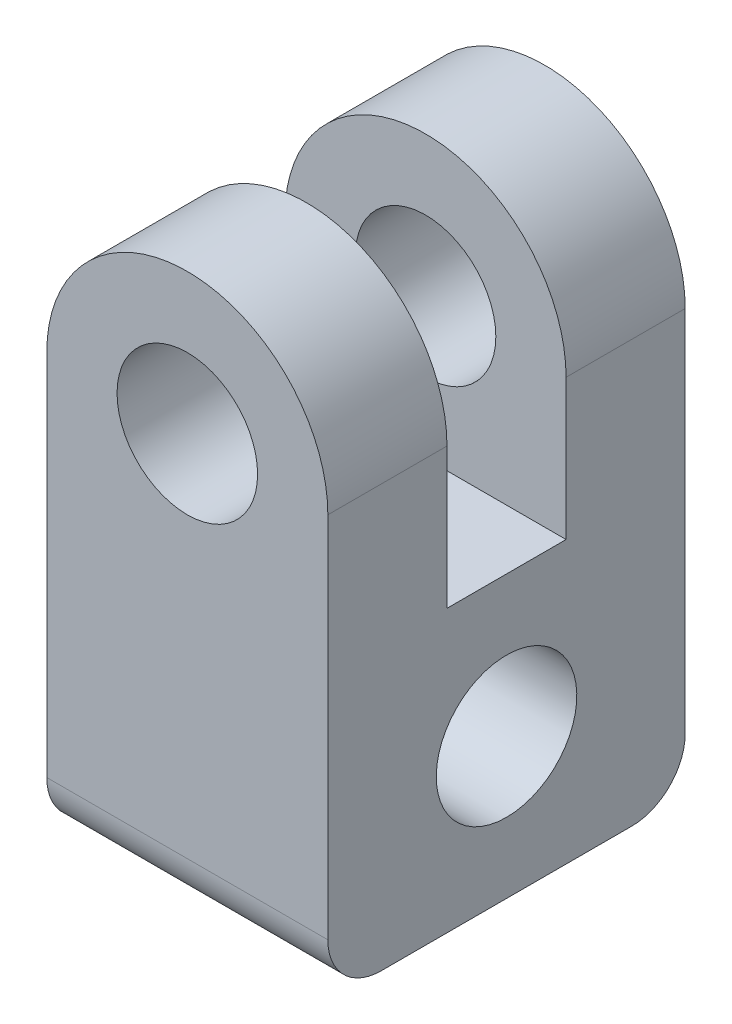
ISO-10303-21;
HEADER;
FILE_DESCRIPTION(('STEP AP214'),'2;1');
FILE_NAME('part.step','',(''),(''),'','','');
FILE_SCHEMA(('AUTOMOTIVE_DESIGN { 1 0 10303 214 1 1 1 1 }'));
ENDSEC;
DATA;
#1=APPLICATION_CONTEXT('core data for automotive mechanical design processes');
#2=APPLICATION_PROTOCOL_DEFINITION('international standard','automotive_design',2000,#1);
#3=PRODUCT_CONTEXT('',#1,'mechanical');
#4=PRODUCT('Part','Part','',(#3));
#5=PRODUCT_RELATED_PRODUCT_CATEGORY('part','',(#4));
#6=PRODUCT_DEFINITION_FORMATION('','',#4);
#7=PRODUCT_DEFINITION_CONTEXT('part definition',#1,'design');
#8=PRODUCT_DEFINITION('design','',#6,#7);
#9=PRODUCT_DEFINITION_SHAPE('','',#8);
#10=(LENGTH_UNIT() NAMED_UNIT(*) SI_UNIT(.MILLI.,.METRE.));
#11=(NAMED_UNIT(*) PLANE_ANGLE_UNIT() SI_UNIT($,.RADIAN.));
#12=(NAMED_UNIT(*) SI_UNIT($,.STERADIAN.) SOLID_ANGLE_UNIT());
#13=UNCERTAINTY_MEASURE_WITH_UNIT(LENGTH_MEASURE(1.E-05),#10,'distance_accuracy_value','');
#14=(GEOMETRIC_REPRESENTATION_CONTEXT(3) GLOBAL_UNCERTAINTY_ASSIGNED_CONTEXT((#13)) GLOBAL_UNIT_ASSIGNED_CONTEXT((#10,
#11,#12)) REPRESENTATION_CONTEXT('',''));
#15=CARTESIAN_POINT('',(0.,0.,0.));
#16=DIRECTION('',(0.,0.,1.));
#17=DIRECTION('',(1.,0.,0.));
#18=AXIS2_PLACEMENT_3D('',#15,#16,#17);
#19=CARTESIAN_POINT('',(0.,0.,133.5));
#20=DIRECTION('',(0.,0.,-1.));
#21=DIRECTION('',(-1.,0.,0.));
#22=AXIS2_PLACEMENT_3D('',#19,#20,#21);
#23=CYLINDRICAL_SURFACE('',#22,52.5);
#24=CARTESIAN_POINT('',(0.,0.,44.5));
#25=DIRECTION('',(0.,0.,1.));
#26=DIRECTION('',(1.,0.,0.));
#27=AXIS2_PLACEMENT_3D('',#24,#25,#26);
#28=CIRCLE('',#27,52.5);
#29=CARTESIAN_POINT('',(52.5,0.,44.5));
#30=VERTEX_POINT('',#29);
#31=CARTESIAN_POINT('',(-52.5,0.,44.5));
#32=VERTEX_POINT('',#31);
#33=EDGE_CURVE('E131',#30,#32,#28,.T.);
#34=ORIENTED_EDGE('',*,*,#33,.F.);
#35=DIRECTION('',(0.,0.,-1.));
#36=VECTOR('',#35,1.);
#37=CARTESIAN_POINT('',(52.5,0.,133.5));
#38=LINE('',#37,#36);
#39=CARTESIAN_POINT('',(52.5,0.,0.));
#40=VERTEX_POINT('',#39);
#41=EDGE_CURVE('E203',#30,#40,#38,.T.);
#42=ORIENTED_EDGE('',*,*,#41,.T.);
#43=CARTESIAN_POINT('',(0.,0.,0.));
#44=DIRECTION('',(0.,0.,1.));
#45=DIRECTION('',(-1.,0.,0.));
#46=AXIS2_PLACEMENT_3D('',#43,#44,#45);
#47=CIRCLE('',#46,52.5);
#48=CARTESIAN_POINT('',(-52.5,0.,0.));
#49=VERTEX_POINT('',#48);
#50=EDGE_CURVE('E187',#40,#49,#47,.T.);
#51=ORIENTED_EDGE('',*,*,#50,.T.);
#52=DIRECTION('',(0.,0.,-1.));
#53=VECTOR('',#52,1.);
#54=CARTESIAN_POINT('',(-52.5,0.,133.5));
#55=LINE('',#54,#53);
#56=EDGE_CURVE('E223',#32,#49,#55,.T.);
#57=ORIENTED_EDGE('',*,*,#56,.F.);
#58=EDGE_LOOP('',(#34,#42,#51,#57));
#59=FACE_BOUND('',#58,.T.);
#60=ADVANCED_FACE('F47',(#59),#23,.T.);
#61=CARTESIAN_POINT('',(0.,0.,89.));
#62=DIRECTION('',(0.,0.,-1.));
#63=DIRECTION('',(-1.,0.,0.));
#64=AXIS2_PLACEMENT_3D('',#61,#62,#63);
#65=CIRCLE('',#64,52.5);
#66=CARTESIAN_POINT('',(-52.5,0.,89.));
#67=VERTEX_POINT('',#66);
#68=CARTESIAN_POINT('',(52.5,0.,89.));
#69=VERTEX_POINT('',#68);
#70=EDGE_CURVE('E168',#67,#69,#65,.T.);
#71=ORIENTED_EDGE('',*,*,#70,.F.);
#72=CARTESIAN_POINT('',(-52.5,0.,133.5));
#73=VERTEX_POINT('',#72);
#74=EDGE_CURVE('E224',#73,#67,#55,.T.);
#75=ORIENTED_EDGE('',*,*,#74,.F.);
#76=CARTESIAN_POINT('',(0.,0.,133.5));
#77=DIRECTION('',(0.,0.,1.));
#78=DIRECTION('',(-1.,0.,0.));
#79=AXIS2_PLACEMENT_3D('',#76,#77,#78);
#80=CIRCLE('',#79,52.5);
#81=CARTESIAN_POINT('',(52.5,0.,133.5));
#82=VERTEX_POINT('',#81);
#83=EDGE_CURVE('E191',#82,#73,#80,.T.);
#84=ORIENTED_EDGE('',*,*,#83,.F.);
#85=EDGE_CURVE('E212',#82,#69,#38,.T.);
#86=ORIENTED_EDGE('',*,*,#85,.T.);
#87=EDGE_LOOP('',(#71,#75,#84,#86));
#88=FACE_BOUND('',#87,.T.);
#89=ADVANCED_FACE('F354',(#88),#23,.T.);
#90=CARTESIAN_POINT('',(-52.5,0.,133.5));
#91=DIRECTION('',(1.,0.,0.));
#92=DIRECTION('',(0.,1.,0.));
#93=AXIS2_PLACEMENT_3D('',#90,#91,#92);
#94=PLANE('',#93);
#95=CARTESIAN_POINT('',(-52.5,-105.,66.7500000000001));
#96=DIRECTION('',(-1.,0.,0.));
#97=DIRECTION('',(0.,-1.,0.));
#98=AXIS2_PLACEMENT_3D('',#95,#96,#97);
#99=CIRCLE('',#98,26.25);
#100=CARTESIAN_POINT('',(-52.5,-131.25,66.7500000000001));
#101=VERTEX_POINT('',#100);
#102=EDGE_CURVE('E174',#101,#101,#99,.T.);
#103=ORIENTED_EDGE('',*,*,#102,.F.);
#104=EDGE_LOOP('',(#103));
#105=FACE_BOUND('',#104,.T.);
#106=DIRECTION('',(0.,0.,-1.));
#107=VECTOR('',#106,1.);
#108=CARTESIAN_POINT('',(-52.5,-157.5,133.5));
#109=LINE('',#108,#107);
#110=CARTESIAN_POINT('',(-52.5,-157.5,113.5));
#111=VERTEX_POINT('',#110);
#112=CARTESIAN_POINT('',(-52.5,-157.5,20.));
#113=VERTEX_POINT('',#112);
#114=EDGE_CURVE('E220',#111,#113,#109,.T.);
#115=ORIENTED_EDGE('',*,*,#114,.F.);
#116=CARTESIAN_POINT('',(-52.5,-137.5,113.5));
#117=DIRECTION('',(1.,0.,0.));
#118=DIRECTION('',(0.,1.,0.));
#119=AXIS2_PLACEMENT_3D('',#116,#117,#118);
#120=CIRCLE('',#119,20.);
#121=CARTESIAN_POINT('',(-52.5,-137.5,133.5));
#122=VERTEX_POINT('',#121);
#123=EDGE_CURVE('E56',#111,#122,#120,.F.);
#124=ORIENTED_EDGE('',*,*,#123,.T.);
#125=DIRECTION('',(0.,-1.,0.));
#126=VECTOR('',#125,1.);
#127=CARTESIAN_POINT('',(-52.5,0.,133.5));
#128=LINE('',#127,#126);
#129=EDGE_CURVE('E195',#73,#122,#128,.T.);
#130=ORIENTED_EDGE('',*,*,#129,.F.);
#131=ORIENTED_EDGE('',*,*,#74,.T.);
#132=DIRECTION('',(0.,1.,0.));
#133=VECTOR('',#132,1.);
#134=CARTESIAN_POINT('',(-52.5,-52.5,89.));
#135=LINE('',#134,#133);
#136=CARTESIAN_POINT('',(-52.5,-52.5,89.));
#137=VERTEX_POINT('',#136);
#138=EDGE_CURVE('E150',#137,#67,#135,.T.);
#139=ORIENTED_EDGE('',*,*,#138,.F.);
#140=DIRECTION('',(0.,0.,-1.));
#141=VECTOR('',#140,1.);
#142=CARTESIAN_POINT('',(-52.5,-52.5,66.7500000000001));
#143=LINE('',#142,#141);
#144=CARTESIAN_POINT('',(-52.5,-52.5,44.5));
#145=VERTEX_POINT('',#144);
#146=EDGE_CURVE('E141',#137,#145,#143,.T.);
#147=ORIENTED_EDGE('',*,*,#146,.T.);
#148=DIRECTION('',(0.,1.,0.));
#149=VECTOR('',#148,1.);
#150=CARTESIAN_POINT('',(-52.5,-52.5,44.5));
#151=LINE('',#150,#149);
#152=EDGE_CURVE('E125',#145,#32,#151,.T.);
#153=ORIENTED_EDGE('',*,*,#152,.T.);
#154=ORIENTED_EDGE('',*,*,#56,.T.);
#155=DIRECTION('',(0.,-1.,0.));
#156=VECTOR('',#155,1.);
#157=CARTESIAN_POINT('',(-52.5,0.,0.));
#158=LINE('',#157,#156);
#159=CARTESIAN_POINT('',(-52.5,-137.5,0.));
#160=VERTEX_POINT('',#159);
#161=EDGE_CURVE('E207',#49,#160,#158,.T.);
#162=ORIENTED_EDGE('',*,*,#161,.T.);
#163=CARTESIAN_POINT('',(-52.5,-137.5,20.));
#164=DIRECTION('',(1.,0.,0.));
#165=DIRECTION('',(0.,1.,0.));
#166=AXIS2_PLACEMENT_3D('',#163,#164,#165);
#167=CIRCLE('',#166,20.);
#168=EDGE_CURVE('E68',#160,#113,#167,.F.);
#169=ORIENTED_EDGE('',*,*,#168,.T.);
#170=EDGE_LOOP('',(#115,#124,#130,#131,#139,#147,#153,#154,#162,#169));
#171=FACE_BOUND('',#170,.T.);
#172=ADVANCED_FACE('F148',(#105,#171),#94,.F.);
#173=CARTESIAN_POINT('',(52.5,-157.5,133.5));
#174=DIRECTION('',(-1.,0.,0.));
#175=DIRECTION('',(0.,0.,1.));
#176=AXIS2_PLACEMENT_3D('',#173,#174,#175);
#177=PLANE('',#176);
#178=CARTESIAN_POINT('',(52.5,-105.,66.7500000000001));
#179=DIRECTION('',(-1.,0.,0.));
#180=DIRECTION('',(0.,-1.,0.));
#181=AXIS2_PLACEMENT_3D('',#178,#179,#180);
#182=CIRCLE('',#181,26.25);
#183=CARTESIAN_POINT('',(52.5,-131.25,66.7500000000001));
#184=VERTEX_POINT('',#183);
#185=EDGE_CURVE('E175',#184,#184,#182,.T.);
#186=ORIENTED_EDGE('',*,*,#185,.T.);
#187=EDGE_LOOP('',(#186));
#188=FACE_BOUND('',#187,.T.);
#189=DIRECTION('',(0.,1.,0.));
#190=VECTOR('',#189,1.);
#191=CARTESIAN_POINT('',(52.5,-157.5,133.5));
#192=LINE('',#191,#190);
#193=CARTESIAN_POINT('',(52.5,-137.5,133.5));
#194=VERTEX_POINT('',#193);
#195=EDGE_CURVE('E200',#194,#82,#192,.T.);
#196=ORIENTED_EDGE('',*,*,#195,.F.);
#197=CARTESIAN_POINT('',(52.5,-137.5,113.5));
#198=DIRECTION('',(-1.,0.,0.));
#199=DIRECTION('',(0.,0.,1.));
#200=AXIS2_PLACEMENT_3D('',#197,#198,#199);
#201=CIRCLE('',#200,20.);
#202=CARTESIAN_POINT('',(52.5,-157.5,113.5));
#203=VERTEX_POINT('',#202);
#204=EDGE_CURVE('E240',#194,#203,#201,.F.);
#205=ORIENTED_EDGE('',*,*,#204,.T.);
#206=DIRECTION('',(0.,0.,-1.));
#207=VECTOR('',#206,1.);
#208=CARTESIAN_POINT('',(52.5,-157.5,133.5));
#209=LINE('',#208,#207);
#210=CARTESIAN_POINT('',(52.5,-157.5,20.));
#211=VERTEX_POINT('',#210);
#212=EDGE_CURVE('E216',#203,#211,#209,.T.);
#213=ORIENTED_EDGE('',*,*,#212,.T.);
#214=CARTESIAN_POINT('',(52.5,-137.5,20.));
#215=DIRECTION('',(-1.,0.,0.));
#216=DIRECTION('',(0.,0.,1.));
#217=AXIS2_PLACEMENT_3D('',#214,#215,#216);
#218=CIRCLE('',#217,20.);
#219=CARTESIAN_POINT('',(52.5,-137.5,0.));
#220=VERTEX_POINT('',#219);
#221=EDGE_CURVE('E237',#211,#220,#218,.F.);
#222=ORIENTED_EDGE('',*,*,#221,.T.);
#223=DIRECTION('',(0.,1.,0.));
#224=VECTOR('',#223,1.);
#225=CARTESIAN_POINT('',(52.5,-157.5,0.));
#226=LINE('',#225,#224);
#227=EDGE_CURVE('E196',#220,#40,#226,.T.);
#228=ORIENTED_EDGE('',*,*,#227,.T.);
#229=ORIENTED_EDGE('',*,*,#41,.F.);
#230=DIRECTION('',(0.,1.,0.));
#231=VECTOR('',#230,1.);
#232=CARTESIAN_POINT('',(52.5,-52.5,44.5));
#233=LINE('',#232,#231);
#234=CARTESIAN_POINT('',(52.5,-52.5,44.5));
#235=VERTEX_POINT('',#234);
#236=EDGE_CURVE('E136',#235,#30,#233,.T.);
#237=ORIENTED_EDGE('',*,*,#236,.F.);
#238=DIRECTION('',(0.,0.,1.));
#239=VECTOR('',#238,1.);
#240=CARTESIAN_POINT('',(52.5,-52.5,89.));
#241=LINE('',#240,#239);
#242=CARTESIAN_POINT('',(52.5,-52.5,89.));
#243=VERTEX_POINT('',#242);
#244=EDGE_CURVE('E144',#235,#243,#241,.T.);
#245=ORIENTED_EDGE('',*,*,#244,.T.);
#246=DIRECTION('',(0.,1.,0.));
#247=VECTOR('',#246,1.);
#248=CARTESIAN_POINT('',(52.5,-52.5,89.));
#249=LINE('',#248,#247);
#250=EDGE_CURVE('E162',#243,#69,#249,.T.);
#251=ORIENTED_EDGE('',*,*,#250,.T.);
#252=ORIENTED_EDGE('',*,*,#85,.F.);
#253=EDGE_LOOP('',(#196,#205,#213,#222,#228,#229,#237,#245,#251,#252));
#254=FACE_BOUND('',#253,.T.);
#255=ADVANCED_FACE('F266',(#188,#254),#177,.F.);
#256=CARTESIAN_POINT('',(0.,0.,133.5));
#257=DIRECTION('',(0.,0.,-1.));
#258=DIRECTION('',(-1.,0.,0.));
#259=AXIS2_PLACEMENT_3D('',#256,#257,#258);
#260=CYLINDRICAL_SURFACE('',#259,26.25);
#261=CARTESIAN_POINT('',(0.,0.,0.));
#262=DIRECTION('',(0.,0.,1.));
#263=DIRECTION('',(1.,0.,0.));
#264=AXIS2_PLACEMENT_3D('',#261,#262,#263);
#265=CIRCLE('',#264,26.25);
#266=CARTESIAN_POINT('',(26.25,0.,0.));
#267=VERTEX_POINT('',#266);
#268=EDGE_CURVE('E179',#267,#267,#265,.T.);
#269=ORIENTED_EDGE('',*,*,#268,.F.);
#270=EDGE_LOOP('',(#269));
#271=FACE_BOUND('',#270,.T.);
#272=CARTESIAN_POINT('',(0.,0.,44.5));
#273=DIRECTION('',(0.,0.,1.));
#274=DIRECTION('',(1.,0.,0.));
#275=AXIS2_PLACEMENT_3D('',#272,#273,#274);
#276=CIRCLE('',#275,26.25);
#277=CARTESIAN_POINT('',(26.25,0.,44.5));
#278=VERTEX_POINT('',#277);
#279=EDGE_CURVE('E171',#278,#278,#276,.T.);
#280=ORIENTED_EDGE('',*,*,#279,.T.);
#281=EDGE_LOOP('',(#280));
#282=FACE_BOUND('',#281,.T.);
#283=ADVANCED_FACE('F428',(#271,#282),#260,.F.);
#284=CARTESIAN_POINT('',(0.,0.,133.5));
#285=DIRECTION('',(0.,0.,1.));
#286=DIRECTION('',(1.,0.,0.));
#287=AXIS2_PLACEMENT_3D('',#284,#285,#286);
#288=CIRCLE('',#287,26.25);
#289=CARTESIAN_POINT('',(26.25,0.,133.5));
#290=VERTEX_POINT('',#289);
#291=EDGE_CURVE('E183',#290,#290,#288,.T.);
#292=ORIENTED_EDGE('',*,*,#291,.T.);
#293=EDGE_LOOP('',(#292));
#294=FACE_BOUND('',#293,.T.);
#295=CARTESIAN_POINT('',(0.,0.,89.));
#296=DIRECTION('',(0.,0.,-1.));
#297=DIRECTION('',(-1.,0.,0.));
#298=AXIS2_PLACEMENT_3D('',#295,#296,#297);
#299=CIRCLE('',#298,26.25);
#300=CARTESIAN_POINT('',(-26.25,0.,89.));
#301=VERTEX_POINT('',#300);
#302=EDGE_CURVE('E135',#301,#301,#299,.T.);
#303=ORIENTED_EDGE('',*,*,#302,.T.);
#304=EDGE_LOOP('',(#303));
#305=FACE_BOUND('',#304,.T.);
#306=ADVANCED_FACE('F437',(#294,#305),#260,.F.);
#307=CARTESIAN_POINT('',(0.,0.,133.5));
#308=DIRECTION('',(0.,0.,-1.));
#309=DIRECTION('',(-1.,0.,0.));
#310=AXIS2_PLACEMENT_3D('',#307,#308,#309);
#311=PLANE('',#310);
#312=ORIENTED_EDGE('',*,*,#129,.T.);
#313=DIRECTION('',(1.,0.,0.));
#314=VECTOR('',#313,1.);
#315=CARTESIAN_POINT('',(0.,-137.5,133.5));
#316=LINE('',#315,#314);
#317=EDGE_CURVE('E227',#122,#194,#316,.T.);
#318=ORIENTED_EDGE('',*,*,#317,.T.);
#319=ORIENTED_EDGE('',*,*,#195,.T.);
#320=ORIENTED_EDGE('',*,*,#83,.T.);
#321=EDGE_LOOP('',(#312,#318,#319,#320));
#322=FACE_BOUND('',#321,.T.);
#323=ORIENTED_EDGE('',*,*,#291,.F.);
#324=EDGE_LOOP('',(#323));
#325=FACE_BOUND('',#324,.T.);
#326=ADVANCED_FACE('F258',(#322,#325),#311,.F.);
#327=CARTESIAN_POINT('',(0.,0.,0.));
#328=DIRECTION('',(0.,0.,-1.));
#329=DIRECTION('',(-1.,0.,0.));
#330=AXIS2_PLACEMENT_3D('',#327,#328,#329);
#331=PLANE('',#330);
#332=ORIENTED_EDGE('',*,*,#227,.F.);
#333=DIRECTION('',(1.,0.,0.));
#334=VECTOR('',#333,1.);
#335=CARTESIAN_POINT('',(-52.5,-137.5,0.));
#336=LINE('',#335,#334);
#337=EDGE_CURVE('E11',#220,#160,#336,.F.);
#338=ORIENTED_EDGE('',*,*,#337,.T.);
#339=ORIENTED_EDGE('',*,*,#161,.F.);
#340=ORIENTED_EDGE('',*,*,#50,.F.);
#341=EDGE_LOOP('',(#332,#338,#339,#340));
#342=FACE_BOUND('',#341,.T.);
#343=ORIENTED_EDGE('',*,*,#268,.T.);
#344=EDGE_LOOP('',(#343));
#345=FACE_BOUND('',#344,.T.);
#346=ADVANCED_FACE('F275',(#342,#345),#331,.T.);
#347=CARTESIAN_POINT('',(-52.5,-157.5,133.5));
#348=DIRECTION('',(0.,1.,0.));
#349=DIRECTION('',(0.,0.,1.));
#350=AXIS2_PLACEMENT_3D('',#347,#348,#349);
#351=PLANE('',#350);
#352=ORIENTED_EDGE('',*,*,#212,.F.);
#353=DIRECTION('',(1.,0.,0.));
#354=VECTOR('',#353,1.);
#355=CARTESIAN_POINT('',(-52.5,-157.5,113.5));
#356=LINE('',#355,#354);
#357=EDGE_CURVE('E247',#203,#111,#356,.F.);
#358=ORIENTED_EDGE('',*,*,#357,.T.);
#359=ORIENTED_EDGE('',*,*,#114,.T.);
#360=DIRECTION('',(1.,0.,0.));
#361=VECTOR('',#360,1.);
#362=CARTESIAN_POINT('',(52.5,-157.5,20.));
#363=LINE('',#362,#361);
#364=EDGE_CURVE('E243',#113,#211,#363,.T.);
#365=ORIENTED_EDGE('',*,*,#364,.T.);
#366=EDGE_LOOP('',(#352,#358,#359,#365));
#367=FACE_BOUND('',#366,.T.);
#368=ADVANCED_FACE('F269',(#367),#351,.F.);
#369=CARTESIAN_POINT('',(52.5,-105.,66.7500000000001));
#370=DIRECTION('',(-1.,0.,0.));
#371=DIRECTION('',(0.,-1.,0.));
#372=AXIS2_PLACEMENT_3D('',#369,#370,#371);
#373=CYLINDRICAL_SURFACE('',#372,26.25);
#374=ORIENTED_EDGE('',*,*,#185,.F.);
#375=EDGE_LOOP('',(#374));
#376=FACE_BOUND('',#375,.T.);
#377=ORIENTED_EDGE('',*,*,#102,.T.);
#378=EDGE_LOOP('',(#377));
#379=FACE_BOUND('',#378,.T.);
#380=ADVANCED_FACE('F364',(#376,#379),#373,.F.);
#381=CARTESIAN_POINT('',(52.5,-52.5,44.5));
#382=DIRECTION('',(0.,0.,1.));
#383=DIRECTION('',(1.,0.,0.));
#384=AXIS2_PLACEMENT_3D('',#381,#382,#383);
#385=PLANE('',#384);
#386=ORIENTED_EDGE('',*,*,#279,.F.);
#387=EDGE_LOOP('',(#386));
#388=FACE_BOUND('',#387,.T.);
#389=ORIENTED_EDGE('',*,*,#33,.T.);
#390=ORIENTED_EDGE('',*,*,#152,.F.);
#391=DIRECTION('',(1.,0.,0.));
#392=VECTOR('',#391,1.);
#393=CARTESIAN_POINT('',(52.5,-52.5,44.5));
#394=LINE('',#393,#392);
#395=EDGE_CURVE('E128',#145,#235,#394,.T.);
#396=ORIENTED_EDGE('',*,*,#395,.T.);
#397=ORIENTED_EDGE('',*,*,#236,.T.);
#398=EDGE_LOOP('',(#389,#390,#396,#397));
#399=FACE_BOUND('',#398,.T.);
#400=ADVANCED_FACE('F127',(#388,#399),#385,.T.);
#401=CARTESIAN_POINT('',(-52.5,-52.5,89.));
#402=DIRECTION('',(0.,0.,-1.));
#403=DIRECTION('',(-1.,0.,0.));
#404=AXIS2_PLACEMENT_3D('',#401,#402,#403);
#405=PLANE('',#404);
#406=ORIENTED_EDGE('',*,*,#302,.F.);
#407=EDGE_LOOP('',(#406));
#408=FACE_BOUND('',#407,.T.);
#409=ORIENTED_EDGE('',*,*,#70,.T.);
#410=ORIENTED_EDGE('',*,*,#250,.F.);
#411=DIRECTION('',(-1.,0.,0.));
#412=VECTOR('',#411,1.);
#413=CARTESIAN_POINT('',(-52.5,-52.5,89.));
#414=LINE('',#413,#412);
#415=EDGE_CURVE('E157',#243,#137,#414,.T.);
#416=ORIENTED_EDGE('',*,*,#415,.T.);
#417=ORIENTED_EDGE('',*,*,#138,.T.);
#418=EDGE_LOOP('',(#409,#410,#416,#417));
#419=FACE_BOUND('',#418,.T.);
#420=ADVANCED_FACE('F355',(#408,#419),#405,.T.);
#421=CARTESIAN_POINT('',(0.,-52.5,0.));
#422=DIRECTION('',(0.,1.,0.));
#423=DIRECTION('',(0.,0.,1.));
#424=AXIS2_PLACEMENT_3D('',#421,#422,#423);
#425=PLANE('',#424);
#426=ORIENTED_EDGE('',*,*,#146,.F.);
#427=ORIENTED_EDGE('',*,*,#415,.F.);
#428=ORIENTED_EDGE('',*,*,#244,.F.);
#429=ORIENTED_EDGE('',*,*,#395,.F.);
#430=EDGE_LOOP('',(#426,#427,#428,#429));
#431=FACE_BOUND('',#430,.T.);
#432=ADVANCED_FACE('F140',(#431),#425,.T.);
#433=CARTESIAN_POINT('',(0.,-137.5,113.5));
#434=DIRECTION('',(1.,0.,0.));
#435=DIRECTION('',(0.,0.,-1.));
#436=AXIS2_PLACEMENT_3D('',#433,#434,#435);
#437=CYLINDRICAL_SURFACE('',#436,20.);
#438=ORIENTED_EDGE('',*,*,#123,.F.);
#439=ORIENTED_EDGE('',*,*,#357,.F.);
#440=ORIENTED_EDGE('',*,*,#204,.F.);
#441=ORIENTED_EDGE('',*,*,#317,.F.);
#442=EDGE_LOOP('',(#438,#439,#440,#441));
#443=FACE_BOUND('',#442,.T.);
#444=ADVANCED_FACE('F263',(#443),#437,.T.);
#445=CARTESIAN_POINT('',(-52.5,-137.5,20.));
#446=DIRECTION('',(-1.,0.,0.));
#447=DIRECTION('',(0.,0.,1.));
#448=AXIS2_PLACEMENT_3D('',#445,#446,#447);
#449=CYLINDRICAL_SURFACE('',#448,20.);
#450=ORIENTED_EDGE('',*,*,#168,.F.);
#451=ORIENTED_EDGE('',*,*,#337,.F.);
#452=ORIENTED_EDGE('',*,*,#221,.F.);
#453=ORIENTED_EDGE('',*,*,#364,.F.);
#454=EDGE_LOOP('',(#450,#451,#452,#453));
#455=FACE_BOUND('',#454,.T.);
#456=ADVANCED_FACE('F49',(#455),#449,.T.);
#457=CLOSED_SHELL('',(#60,#89,#172,#255,#283,#306,#326,#346,#368,#380,#400,#420,#432,#444,#456));
#458=MANIFOLD_SOLID_BREP('B2',#457);
#459=ADVANCED_BREP_SHAPE_REPRESENTATION('',(#18,#458),#14);
#460=SHAPE_DEFINITION_REPRESENTATION(#9,#459);
ENDSEC;
END-ISO-10303-21;
